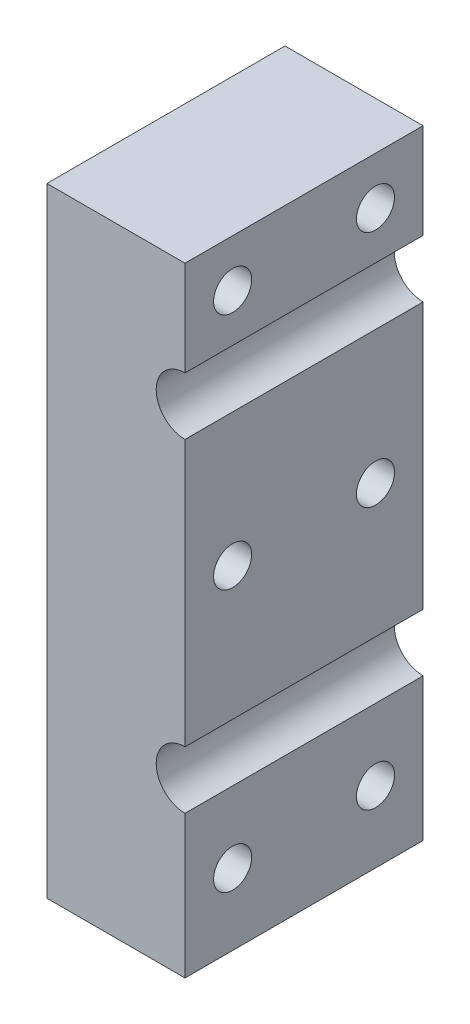
ISO-10303-21;
HEADER;
FILE_DESCRIPTION(('STEP AP214'),'2;1');
FILE_NAME('part.step','',(''),(''),'','','');
FILE_SCHEMA(('AUTOMOTIVE_DESIGN { 1 0 10303 214 1 1 1 1 }'));
ENDSEC;
DATA;
#1=APPLICATION_CONTEXT('core data for automotive mechanical design processes');
#2=APPLICATION_PROTOCOL_DEFINITION('international standard','automotive_design',2000,#1);
#3=PRODUCT_CONTEXT('',#1,'mechanical');
#4=PRODUCT('Part','Part','',(#3));
#5=PRODUCT_RELATED_PRODUCT_CATEGORY('part','',(#4));
#6=PRODUCT_DEFINITION_FORMATION('','',#4);
#7=PRODUCT_DEFINITION_CONTEXT('part definition',#1,'design');
#8=PRODUCT_DEFINITION('design','',#6,#7);
#9=PRODUCT_DEFINITION_SHAPE('','',#8);
#10=(LENGTH_UNIT() NAMED_UNIT(*) SI_UNIT(.MILLI.,.METRE.));
#11=(NAMED_UNIT(*) PLANE_ANGLE_UNIT() SI_UNIT($,.RADIAN.));
#12=(NAMED_UNIT(*) SI_UNIT($,.STERADIAN.) SOLID_ANGLE_UNIT());
#13=UNCERTAINTY_MEASURE_WITH_UNIT(LENGTH_MEASURE(1.E-05),#10,'distance_accuracy_value','');
#14=(GEOMETRIC_REPRESENTATION_CONTEXT(3) GLOBAL_UNCERTAINTY_ASSIGNED_CONTEXT((#13)) GLOBAL_UNIT_ASSIGNED_CONTEXT((#10,
#11,#12)) REPRESENTATION_CONTEXT('',''));
#15=CARTESIAN_POINT('',(0.,0.,0.));
#16=DIRECTION('',(0.,0.,1.));
#17=DIRECTION('',(1.,0.,0.));
#18=AXIS2_PLACEMENT_3D('',#15,#16,#17);
#19=CARTESIAN_POINT('',(0.,0.,25.));
#20=DIRECTION('',(1.,0.,0.));
#21=DIRECTION('',(0.,0.,-1.));
#22=AXIS2_PLACEMENT_3D('',#19,#20,#21);
#23=PLANE('',#22);
#24=CARTESIAN_POINT('',(0.,7.4875,20.));
#25=DIRECTION('',(1.,0.,0.));
#26=DIRECTION('',(0.,0.,-1.));
#27=AXIS2_PLACEMENT_3D('',#24,#25,#26);
#28=CIRCLE('',#27,2.);
#29=CARTESIAN_POINT('',(0.,7.4875,18.));
#30=VERTEX_POINT('',#29);
#31=EDGE_CURVE('E320',#30,#30,#28,.T.);
#32=ORIENTED_EDGE('',*,*,#31,.T.);
#33=EDGE_LOOP('',(#32));
#34=FACE_BOUND('',#33,.T.);
#35=CARTESIAN_POINT('',(0.,7.4875,5.));
#36=DIRECTION('',(1.,0.,0.));
#37=DIRECTION('',(0.,0.,-1.));
#38=AXIS2_PLACEMENT_3D('',#35,#36,#37);
#39=CIRCLE('',#38,2.);
#40=CARTESIAN_POINT('',(0.,7.4875,3.));
#41=VERTEX_POINT('',#40);
#42=EDGE_CURVE('E324',#41,#41,#39,.T.);
#43=ORIENTED_EDGE('',*,*,#42,.T.);
#44=EDGE_LOOP('',(#43));
#45=FACE_BOUND('',#44,.T.);
#46=CARTESIAN_POINT('',(0.,35.0000000000005,20.));
#47=DIRECTION('',(1.,0.,0.));
#48=DIRECTION('',(0.,0.,-1.));
#49=AXIS2_PLACEMENT_3D('',#46,#47,#48);
#50=CIRCLE('',#49,2.);
#51=CARTESIAN_POINT('',(0.,35.0000000000005,18.));
#52=VERTEX_POINT('',#51);
#53=EDGE_CURVE('E334',#52,#52,#50,.T.);
#54=ORIENTED_EDGE('',*,*,#53,.T.);
#55=EDGE_LOOP('',(#54));
#56=FACE_BOUND('',#55,.T.);
#57=CARTESIAN_POINT('',(0.,35.0000000000005,5.));
#58=DIRECTION('',(1.,0.,0.));
#59=DIRECTION('',(0.,0.,-1.));
#60=AXIS2_PLACEMENT_3D('',#57,#58,#59);
#61=CIRCLE('',#60,2.);
#62=CARTESIAN_POINT('',(0.,35.0000000000005,3.));
#63=VERTEX_POINT('',#62);
#64=EDGE_CURVE('E341',#63,#63,#61,.T.);
#65=ORIENTED_EDGE('',*,*,#64,.T.);
#66=EDGE_LOOP('',(#65));
#67=FACE_BOUND('',#66,.T.);
#68=CARTESIAN_POINT('',(0.,60.0124999999995,20.));
#69=DIRECTION('',(1.,0.,0.));
#70=DIRECTION('',(0.,0.,-1.));
#71=AXIS2_PLACEMENT_3D('',#68,#69,#70);
#72=CIRCLE('',#71,2.);
#73=CARTESIAN_POINT('',(0.,60.0124999999995,18.));
#74=VERTEX_POINT('',#73);
#75=EDGE_CURVE('E161',#74,#74,#72,.T.);
#76=ORIENTED_EDGE('',*,*,#75,.T.);
#77=EDGE_LOOP('',(#76));
#78=FACE_BOUND('',#77,.T.);
#79=CARTESIAN_POINT('',(0.,60.0124999999995,5.));
#80=DIRECTION('',(1.,0.,0.));
#81=DIRECTION('',(0.,0.,-1.));
#82=AXIS2_PLACEMENT_3D('',#79,#80,#81);
#83=CIRCLE('',#82,2.);
#84=CARTESIAN_POINT('',(0.,60.0124999999995,3.));
#85=VERTEX_POINT('',#84);
#86=EDGE_CURVE('E351',#85,#85,#83,.T.);
#87=ORIENTED_EDGE('',*,*,#86,.T.);
#88=EDGE_LOOP('',(#87));
#89=FACE_BOUND('',#88,.T.);
#90=DIRECTION('',(0.,-1.,0.));
#91=VECTOR('',#90,1.);
#92=CARTESIAN_POINT('',(0.,0.,0.));
#93=LINE('',#92,#91);
#94=CARTESIAN_POINT('',(0.,65.,0.));
#95=VERTEX_POINT('',#94);
#96=CARTESIAN_POINT('',(0.,0.,0.));
#97=VERTEX_POINT('',#96);
#98=EDGE_CURVE('E126',#95,#97,#93,.T.);
#99=ORIENTED_EDGE('',*,*,#98,.T.);
#100=DIRECTION('',(0.,0.,-1.));
#101=VECTOR('',#100,1.);
#102=CARTESIAN_POINT('',(0.,0.,25.));
#103=LINE('',#102,#101);
#104=CARTESIAN_POINT('',(0.,0.,25.));
#105=VERTEX_POINT('',#104);
#106=EDGE_CURVE('E119',#105,#97,#103,.T.);
#107=ORIENTED_EDGE('',*,*,#106,.F.);
#108=DIRECTION('',(0.,-1.,0.));
#109=VECTOR('',#108,1.);
#110=CARTESIAN_POINT('',(0.,0.,25.));
#111=LINE('',#110,#109);
#112=CARTESIAN_POINT('',(0.,65.,25.));
#113=VERTEX_POINT('',#112);
#114=EDGE_CURVE('E137',#113,#105,#111,.T.);
#115=ORIENTED_EDGE('',*,*,#114,.F.);
#116=DIRECTION('',(0.,0.,-1.));
#117=VECTOR('',#116,1.);
#118=CARTESIAN_POINT('',(0.,65.,25.));
#119=LINE('',#118,#117);
#120=EDGE_CURVE('E121',#113,#95,#119,.T.);
#121=ORIENTED_EDGE('',*,*,#120,.T.);
#122=EDGE_LOOP('',(#99,#107,#115,#121));
#123=FACE_BOUND('',#122,.T.);
#124=ADVANCED_FACE('F33',(#34,#45,#56,#67,#78,#89,#123),#23,.F.);
#125=CARTESIAN_POINT('',(0.,0.,25.));
#126=DIRECTION('',(0.,1.,0.));
#127=DIRECTION('',(0.,0.,1.));
#128=AXIS2_PLACEMENT_3D('',#125,#126,#127);
#129=PLANE('',#128);
#130=DIRECTION('',(1.,0.,0.));
#131=VECTOR('',#130,1.);
#132=CARTESIAN_POINT('',(0.,0.,0.));
#133=LINE('',#132,#131);
#134=CARTESIAN_POINT('',(14.5,0.,0.));
#135=VERTEX_POINT('',#134);
#136=EDGE_CURVE('E110',#97,#135,#133,.T.);
#137=ORIENTED_EDGE('',*,*,#136,.T.);
#138=DIRECTION('',(0.,0.,1.));
#139=VECTOR('',#138,1.);
#140=CARTESIAN_POINT('',(14.5,0.,0.));
#141=LINE('',#140,#139);
#142=CARTESIAN_POINT('',(14.5,0.,25.));
#143=VERTEX_POINT('',#142);
#144=EDGE_CURVE('E96',#135,#143,#141,.T.);
#145=ORIENTED_EDGE('',*,*,#144,.T.);
#146=DIRECTION('',(1.,0.,0.));
#147=VECTOR('',#146,1.);
#148=CARTESIAN_POINT('',(0.,0.,25.));
#149=LINE('',#148,#147);
#150=EDGE_CURVE('E135',#105,#143,#149,.T.);
#151=ORIENTED_EDGE('',*,*,#150,.F.);
#152=ORIENTED_EDGE('',*,*,#106,.T.);
#153=EDGE_LOOP('',(#137,#145,#151,#152));
#154=FACE_BOUND('',#153,.T.);
#155=ADVANCED_FACE('F117',(#154),#129,.F.);
#156=CARTESIAN_POINT('',(0.,65.,25.));
#157=DIRECTION('',(0.,-1.,0.));
#158=DIRECTION('',(0.,0.,-1.));
#159=AXIS2_PLACEMENT_3D('',#156,#157,#158);
#160=PLANE('',#159);
#161=DIRECTION('',(-1.,0.,0.));
#162=VECTOR('',#161,1.);
#163=CARTESIAN_POINT('',(0.,65.,25.));
#164=LINE('',#163,#162);
#165=CARTESIAN_POINT('',(14.5,65.,25.));
#166=VERTEX_POINT('',#165);
#167=EDGE_CURVE('E132',#166,#113,#164,.T.);
#168=ORIENTED_EDGE('',*,*,#167,.F.);
#169=DIRECTION('',(0.,0.,1.));
#170=VECTOR('',#169,1.);
#171=CARTESIAN_POINT('',(14.5,65.,0.));
#172=LINE('',#171,#170);
#173=CARTESIAN_POINT('',(14.5,65.,0.));
#174=VERTEX_POINT('',#173);
#175=EDGE_CURVE('E103',#174,#166,#172,.T.);
#176=ORIENTED_EDGE('',*,*,#175,.F.);
#177=DIRECTION('',(-1.,0.,0.));
#178=VECTOR('',#177,1.);
#179=CARTESIAN_POINT('',(0.,65.,0.));
#180=LINE('',#179,#178);
#181=EDGE_CURVE('E123',#174,#95,#180,.T.);
#182=ORIENTED_EDGE('',*,*,#181,.T.);
#183=ORIENTED_EDGE('',*,*,#120,.F.);
#184=EDGE_LOOP('',(#168,#176,#182,#183));
#185=FACE_BOUND('',#184,.T.);
#186=ADVANCED_FACE('F175',(#185),#160,.F.);
#187=CARTESIAN_POINT('',(0.,0.,25.));
#188=DIRECTION('',(0.,0.,-1.));
#189=DIRECTION('',(-1.,0.,0.));
#190=AXIS2_PLACEMENT_3D('',#187,#188,#189);
#191=PLANE('',#190);
#192=ORIENTED_EDGE('',*,*,#150,.T.);
#193=DIRECTION('',(0.,-1.,0.));
#194=VECTOR('',#193,1.);
#195=CARTESIAN_POINT('',(14.5,65.,25.));
#196=LINE('',#195,#194);
#197=CARTESIAN_POINT('',(14.5,14.975,25.));
#198=VERTEX_POINT('',#197);
#199=EDGE_CURVE('E99',#198,#143,#196,.T.);
#200=ORIENTED_EDGE('',*,*,#199,.F.);
#201=CARTESIAN_POINT('',(14.5,18.,25.));
#202=DIRECTION('',(0.,0.,1.));
#203=DIRECTION('',(1.,0.,0.));
#204=AXIS2_PLACEMENT_3D('',#201,#202,#203);
#205=CIRCLE('',#204,3.025);
#206=CARTESIAN_POINT('',(14.5,21.025,25.));
#207=VERTEX_POINT('',#206);
#208=EDGE_CURVE('E140',#207,#198,#205,.T.);
#209=ORIENTED_EDGE('',*,*,#208,.F.);
#210=CARTESIAN_POINT('',(14.5,48.975000000001,25.));
#211=VERTEX_POINT('',#210);
#212=EDGE_CURVE('E157',#211,#207,#196,.T.);
#213=ORIENTED_EDGE('',*,*,#212,.F.);
#214=CARTESIAN_POINT('',(14.5,52.,25.));
#215=DIRECTION('',(0.,0.,1.));
#216=DIRECTION('',(1.,0.,0.));
#217=AXIS2_PLACEMENT_3D('',#214,#215,#216);
#218=CIRCLE('',#217,3.02499999999901);
#219=CARTESIAN_POINT('',(14.5,55.024999999999,25.));
#220=VERTEX_POINT('',#219);
#221=EDGE_CURVE('E143',#220,#211,#218,.T.);
#222=ORIENTED_EDGE('',*,*,#221,.F.);
#223=EDGE_CURVE('E56',#166,#220,#196,.T.);
#224=ORIENTED_EDGE('',*,*,#223,.F.);
#225=ORIENTED_EDGE('',*,*,#167,.T.);
#226=ORIENTED_EDGE('',*,*,#114,.T.);
#227=EDGE_LOOP('',(#192,#200,#209,#213,#222,#224,#225,#226));
#228=FACE_BOUND('',#227,.T.);
#229=ADVANCED_FACE('F35',(#228),#191,.F.);
#230=CARTESIAN_POINT('',(0.,0.,0.));
#231=DIRECTION('',(0.,0.,-1.));
#232=DIRECTION('',(-1.,0.,0.));
#233=AXIS2_PLACEMENT_3D('',#230,#231,#232);
#234=PLANE('',#233);
#235=DIRECTION('',(0.,-1.,0.));
#236=VECTOR('',#235,1.);
#237=CARTESIAN_POINT('',(14.5,65.,0.));
#238=LINE('',#237,#236);
#239=CARTESIAN_POINT('',(14.5,14.975,0.));
#240=VERTEX_POINT('',#239);
#241=EDGE_CURVE('E48',#240,#135,#238,.T.);
#242=ORIENTED_EDGE('',*,*,#241,.T.);
#243=ORIENTED_EDGE('',*,*,#136,.F.);
#244=ORIENTED_EDGE('',*,*,#98,.F.);
#245=ORIENTED_EDGE('',*,*,#181,.F.);
#246=CARTESIAN_POINT('',(14.5,55.024999999999,0.));
#247=VERTEX_POINT('',#246);
#248=EDGE_CURVE('E104',#174,#247,#238,.T.);
#249=ORIENTED_EDGE('',*,*,#248,.T.);
#250=CARTESIAN_POINT('',(14.5,52.,0.));
#251=DIRECTION('',(0.,0.,1.));
#252=DIRECTION('',(1.,0.,0.));
#253=AXIS2_PLACEMENT_3D('',#250,#251,#252);
#254=CIRCLE('',#253,3.02499999999901);
#255=CARTESIAN_POINT('',(14.5,48.975000000001,0.));
#256=VERTEX_POINT('',#255);
#257=EDGE_CURVE('E134',#247,#256,#254,.T.);
#258=ORIENTED_EDGE('',*,*,#257,.T.);
#259=CARTESIAN_POINT('',(14.5,21.025,0.));
#260=VERTEX_POINT('',#259);
#261=EDGE_CURVE('E115',#256,#260,#238,.T.);
#262=ORIENTED_EDGE('',*,*,#261,.T.);
#263=CARTESIAN_POINT('',(14.5,18.,0.));
#264=DIRECTION('',(0.,0.,1.));
#265=DIRECTION('',(1.,0.,0.));
#266=AXIS2_PLACEMENT_3D('',#263,#264,#265);
#267=CIRCLE('',#266,3.025);
#268=EDGE_CURVE('E114',#260,#240,#267,.T.);
#269=ORIENTED_EDGE('',*,*,#268,.T.);
#270=EDGE_LOOP('',(#242,#243,#244,#245,#249,#258,#262,#269));
#271=FACE_BOUND('',#270,.T.);
#272=ADVANCED_FACE('F108',(#271),#234,.T.);
#273=CARTESIAN_POINT('',(14.5,18.,0.));
#274=DIRECTION('',(0.,0.,1.));
#275=DIRECTION('',(1.,0.,0.));
#276=AXIS2_PLACEMENT_3D('',#273,#274,#275);
#277=CYLINDRICAL_SURFACE('',#276,3.025);
#278=ORIENTED_EDGE('',*,*,#208,.T.);
#279=DIRECTION('',(0.,0.,1.));
#280=VECTOR('',#279,1.);
#281=CARTESIAN_POINT('',(14.5,14.975,0.));
#282=LINE('',#281,#280);
#283=EDGE_CURVE('E131',#198,#240,#282,.F.);
#284=ORIENTED_EDGE('',*,*,#283,.T.);
#285=ORIENTED_EDGE('',*,*,#268,.F.);
#286=DIRECTION('',(0.,0.,1.));
#287=VECTOR('',#286,1.);
#288=CARTESIAN_POINT('',(14.5,21.025,0.));
#289=LINE('',#288,#287);
#290=EDGE_CURVE('E164',#260,#207,#289,.T.);
#291=ORIENTED_EDGE('',*,*,#290,.T.);
#292=EDGE_LOOP('',(#278,#284,#285,#291));
#293=FACE_BOUND('',#292,.T.);
#294=ADVANCED_FACE('F168',(#293),#277,.F.);
#295=CARTESIAN_POINT('',(14.5,52.,0.));
#296=DIRECTION('',(0.,0.,1.));
#297=DIRECTION('',(1.,0.,0.));
#298=AXIS2_PLACEMENT_3D('',#295,#296,#297);
#299=CYLINDRICAL_SURFACE('',#298,3.02499999999901);
#300=ORIENTED_EDGE('',*,*,#221,.T.);
#301=DIRECTION('',(0.,0.,1.));
#302=VECTOR('',#301,1.);
#303=CARTESIAN_POINT('',(14.5,48.975000000001,0.));
#304=LINE('',#303,#302);
#305=EDGE_CURVE('E11',#211,#256,#304,.F.);
#306=ORIENTED_EDGE('',*,*,#305,.T.);
#307=ORIENTED_EDGE('',*,*,#257,.F.);
#308=DIRECTION('',(0.,0.,1.));
#309=VECTOR('',#308,1.);
#310=CARTESIAN_POINT('',(14.5,55.024999999999,0.));
#311=LINE('',#310,#309);
#312=EDGE_CURVE('E41',#247,#220,#311,.T.);
#313=ORIENTED_EDGE('',*,*,#312,.T.);
#314=EDGE_LOOP('',(#300,#306,#307,#313));
#315=FACE_BOUND('',#314,.T.);
#316=ADVANCED_FACE('F151',(#315),#299,.F.);
#317=CARTESIAN_POINT('',(14.5,65.,0.));
#318=DIRECTION('',(-1.,0.,0.));
#319=DIRECTION('',(0.,0.,1.));
#320=AXIS2_PLACEMENT_3D('',#317,#318,#319);
#321=PLANE('',#320);
#322=CARTESIAN_POINT('',(14.5,60.0124999999995,20.));
#323=DIRECTION('',(1.,0.,0.));
#324=DIRECTION('',(0.,0.,-1.));
#325=AXIS2_PLACEMENT_3D('',#322,#323,#324);
#326=CIRCLE('',#325,2.);
#327=CARTESIAN_POINT('',(14.5,60.0124999999995,18.));
#328=VERTEX_POINT('',#327);
#329=EDGE_CURVE('E348',#328,#328,#326,.T.);
#330=ORIENTED_EDGE('',*,*,#329,.F.);
#331=EDGE_LOOP('',(#330));
#332=FACE_BOUND('',#331,.T.);
#333=CARTESIAN_POINT('',(14.5,60.0124999999995,5.));
#334=DIRECTION('',(1.,0.,0.));
#335=DIRECTION('',(0.,0.,-1.));
#336=AXIS2_PLACEMENT_3D('',#333,#334,#335);
#337=CIRCLE('',#336,2.);
#338=CARTESIAN_POINT('',(14.5,60.0124999999995,3.));
#339=VERTEX_POINT('',#338);
#340=EDGE_CURVE('E337',#339,#339,#337,.T.);
#341=ORIENTED_EDGE('',*,*,#340,.F.);
#342=EDGE_LOOP('',(#341));
#343=FACE_BOUND('',#342,.T.);
#344=ORIENTED_EDGE('',*,*,#248,.F.);
#345=ORIENTED_EDGE('',*,*,#175,.T.);
#346=ORIENTED_EDGE('',*,*,#223,.T.);
#347=ORIENTED_EDGE('',*,*,#312,.F.);
#348=EDGE_LOOP('',(#344,#345,#346,#347));
#349=FACE_BOUND('',#348,.T.);
#350=ADVANCED_FACE('F176',(#332,#343,#349),#321,.F.);
#351=CARTESIAN_POINT('',(14.5,35.0000000000005,20.));
#352=DIRECTION('',(1.,0.,0.));
#353=DIRECTION('',(0.,0.,-1.));
#354=AXIS2_PLACEMENT_3D('',#351,#352,#353);
#355=CIRCLE('',#354,2.);
#356=CARTESIAN_POINT('',(14.5,35.0000000000005,18.));
#357=VERTEX_POINT('',#356);
#358=EDGE_CURVE('E338',#357,#357,#355,.T.);
#359=ORIENTED_EDGE('',*,*,#358,.F.);
#360=EDGE_LOOP('',(#359));
#361=FACE_BOUND('',#360,.T.);
#362=CARTESIAN_POINT('',(14.5,35.0000000000005,5.));
#363=DIRECTION('',(1.,0.,0.));
#364=DIRECTION('',(0.,0.,-1.));
#365=AXIS2_PLACEMENT_3D('',#362,#363,#364);
#366=CIRCLE('',#365,2.);
#367=CARTESIAN_POINT('',(14.5,35.0000000000005,3.));
#368=VERTEX_POINT('',#367);
#369=EDGE_CURVE('E326',#368,#368,#366,.T.);
#370=ORIENTED_EDGE('',*,*,#369,.F.);
#371=EDGE_LOOP('',(#370));
#372=FACE_BOUND('',#371,.T.);
#373=ORIENTED_EDGE('',*,*,#261,.F.);
#374=ORIENTED_EDGE('',*,*,#305,.F.);
#375=ORIENTED_EDGE('',*,*,#212,.T.);
#376=ORIENTED_EDGE('',*,*,#290,.F.);
#377=EDGE_LOOP('',(#373,#374,#375,#376));
#378=FACE_BOUND('',#377,.T.);
#379=ADVANCED_FACE('F177',(#361,#372,#378),#321,.F.);
#380=CARTESIAN_POINT('',(14.5,7.4875,20.));
#381=DIRECTION('',(1.,0.,0.));
#382=DIRECTION('',(0.,0.,-1.));
#383=AXIS2_PLACEMENT_3D('',#380,#381,#382);
#384=CIRCLE('',#383,2.);
#385=CARTESIAN_POINT('',(14.5,7.4875,18.));
#386=VERTEX_POINT('',#385);
#387=EDGE_CURVE('E323',#386,#386,#384,.T.);
#388=ORIENTED_EDGE('',*,*,#387,.F.);
#389=EDGE_LOOP('',(#388));
#390=FACE_BOUND('',#389,.T.);
#391=CARTESIAN_POINT('',(14.5,7.4875,5.));
#392=DIRECTION('',(1.,0.,0.));
#393=DIRECTION('',(0.,0.,-1.));
#394=AXIS2_PLACEMENT_3D('',#391,#392,#393);
#395=CIRCLE('',#394,2.);
#396=CARTESIAN_POINT('',(14.5,7.4875,3.));
#397=VERTEX_POINT('',#396);
#398=EDGE_CURVE('E329',#397,#397,#395,.T.);
#399=ORIENTED_EDGE('',*,*,#398,.F.);
#400=EDGE_LOOP('',(#399));
#401=FACE_BOUND('',#400,.T.);
#402=ORIENTED_EDGE('',*,*,#199,.T.);
#403=ORIENTED_EDGE('',*,*,#144,.F.);
#404=ORIENTED_EDGE('',*,*,#241,.F.);
#405=ORIENTED_EDGE('',*,*,#283,.F.);
#406=EDGE_LOOP('',(#402,#403,#404,#405));
#407=FACE_BOUND('',#406,.T.);
#408=ADVANCED_FACE('F97',(#390,#401,#407),#321,.F.);
#409=CARTESIAN_POINT('',(0.,60.0124999999995,5.));
#410=DIRECTION('',(1.,0.,0.));
#411=DIRECTION('',(0.,0.,-1.));
#412=AXIS2_PLACEMENT_3D('',#409,#410,#411);
#413=CYLINDRICAL_SURFACE('',#412,2.);
#414=ORIENTED_EDGE('',*,*,#86,.F.);
#415=EDGE_LOOP('',(#414));
#416=FACE_BOUND('',#415,.T.);
#417=ORIENTED_EDGE('',*,*,#340,.T.);
#418=EDGE_LOOP('',(#417));
#419=FACE_BOUND('',#418,.T.);
#420=ADVANCED_FACE('F185',(#416,#419),#413,.F.);
#421=CARTESIAN_POINT('',(0.,60.0124999999995,20.));
#422=DIRECTION('',(1.,0.,0.));
#423=DIRECTION('',(0.,0.,-1.));
#424=AXIS2_PLACEMENT_3D('',#421,#422,#423);
#425=CYLINDRICAL_SURFACE('',#424,2.);
#426=ORIENTED_EDGE('',*,*,#75,.F.);
#427=EDGE_LOOP('',(#426));
#428=FACE_BOUND('',#427,.T.);
#429=ORIENTED_EDGE('',*,*,#329,.T.);
#430=EDGE_LOOP('',(#429));
#431=FACE_BOUND('',#430,.T.);
#432=ADVANCED_FACE('F268',(#428,#431),#425,.F.);
#433=CARTESIAN_POINT('',(0.,35.0000000000005,5.));
#434=DIRECTION('',(1.,0.,0.));
#435=DIRECTION('',(0.,0.,-1.));
#436=AXIS2_PLACEMENT_3D('',#433,#434,#435);
#437=CYLINDRICAL_SURFACE('',#436,2.);
#438=ORIENTED_EDGE('',*,*,#64,.F.);
#439=EDGE_LOOP('',(#438));
#440=FACE_BOUND('',#439,.T.);
#441=ORIENTED_EDGE('',*,*,#369,.T.);
#442=EDGE_LOOP('',(#441));
#443=FACE_BOUND('',#442,.T.);
#444=ADVANCED_FACE('F275',(#440,#443),#437,.F.);
#445=CARTESIAN_POINT('',(0.,35.0000000000005,20.));
#446=DIRECTION('',(1.,0.,0.));
#447=DIRECTION('',(0.,0.,-1.));
#448=AXIS2_PLACEMENT_3D('',#445,#446,#447);
#449=CYLINDRICAL_SURFACE('',#448,2.);
#450=ORIENTED_EDGE('',*,*,#53,.F.);
#451=EDGE_LOOP('',(#450));
#452=FACE_BOUND('',#451,.T.);
#453=ORIENTED_EDGE('',*,*,#358,.T.);
#454=EDGE_LOOP('',(#453));
#455=FACE_BOUND('',#454,.T.);
#456=ADVANCED_FACE('F283',(#452,#455),#449,.F.);
#457=CARTESIAN_POINT('',(0.,7.4875,5.));
#458=DIRECTION('',(1.,0.,0.));
#459=DIRECTION('',(0.,0.,-1.));
#460=AXIS2_PLACEMENT_3D('',#457,#458,#459);
#461=CYLINDRICAL_SURFACE('',#460,2.);
#462=ORIENTED_EDGE('',*,*,#42,.F.);
#463=EDGE_LOOP('',(#462));
#464=FACE_BOUND('',#463,.T.);
#465=ORIENTED_EDGE('',*,*,#398,.T.);
#466=EDGE_LOOP('',(#465));
#467=FACE_BOUND('',#466,.T.);
#468=ADVANCED_FACE('F292',(#464,#467),#461,.F.);
#469=CARTESIAN_POINT('',(0.,7.4875,20.));
#470=DIRECTION('',(1.,0.,0.));
#471=DIRECTION('',(0.,0.,-1.));
#472=AXIS2_PLACEMENT_3D('',#469,#470,#471);
#473=CYLINDRICAL_SURFACE('',#472,2.);
#474=ORIENTED_EDGE('',*,*,#31,.F.);
#475=EDGE_LOOP('',(#474));
#476=FACE_BOUND('',#475,.T.);
#477=ORIENTED_EDGE('',*,*,#387,.T.);
#478=EDGE_LOOP('',(#477));
#479=FACE_BOUND('',#478,.T.);
#480=ADVANCED_FACE('F300',(#476,#479),#473,.F.);
#481=CLOSED_SHELL('',(#124,#155,#186,#229,#272,#294,#316,#350,#379,#408,#420,#432,#444,#456,
#468,#480));
#482=MANIFOLD_SOLID_BREP('B2',#481);
#483=ADVANCED_BREP_SHAPE_REPRESENTATION('',(#18,#482),#14);
#484=SHAPE_DEFINITION_REPRESENTATION(#9,#483);
ENDSEC;
END-ISO-10303-21;
